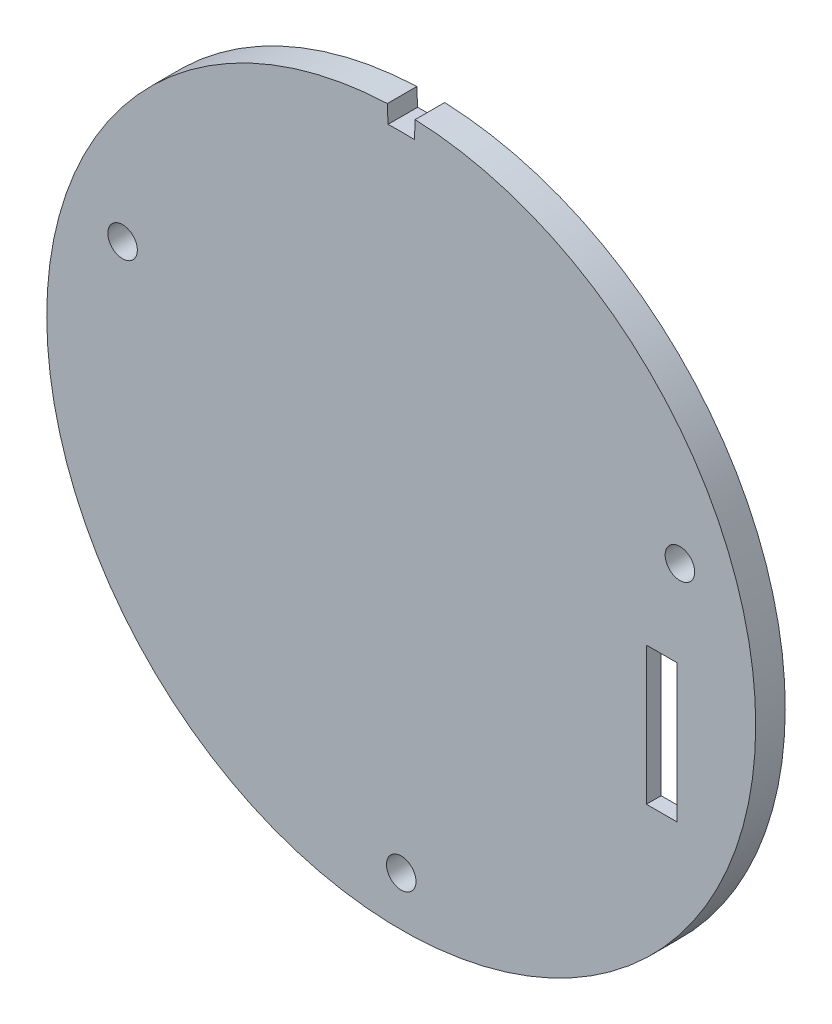
ISO-10303-21;
HEADER;
FILE_DESCRIPTION(('STEP AP214'),'2;1');
FILE_NAME('part.step','',(''),(''),'','','');
FILE_SCHEMA(('AUTOMOTIVE_DESIGN { 1 0 10303 214 1 1 1 1 }'));
ENDSEC;
DATA;
#1=APPLICATION_CONTEXT('core data for automotive mechanical design processes');
#2=APPLICATION_PROTOCOL_DEFINITION('international standard','automotive_design',2000,#1);
#3=PRODUCT_CONTEXT('',#1,'mechanical');
#4=PRODUCT('Part','Part','',(#3));
#5=PRODUCT_RELATED_PRODUCT_CATEGORY('part','',(#4));
#6=PRODUCT_DEFINITION_FORMATION('','',#4);
#7=PRODUCT_DEFINITION_CONTEXT('part definition',#1,'design');
#8=PRODUCT_DEFINITION('design','',#6,#7);
#9=PRODUCT_DEFINITION_SHAPE('','',#8);
#10=(LENGTH_UNIT() NAMED_UNIT(*) SI_UNIT(.MILLI.,.METRE.));
#11=(NAMED_UNIT(*) PLANE_ANGLE_UNIT() SI_UNIT($,.RADIAN.));
#12=(NAMED_UNIT(*) SI_UNIT($,.STERADIAN.) SOLID_ANGLE_UNIT());
#13=UNCERTAINTY_MEASURE_WITH_UNIT(LENGTH_MEASURE(1.E-05),#10,'distance_accuracy_value','');
#14=(GEOMETRIC_REPRESENTATION_CONTEXT(3) GLOBAL_UNCERTAINTY_ASSIGNED_CONTEXT((#13)) GLOBAL_UNIT_ASSIGNED_CONTEXT((#10,
#11,#12)) REPRESENTATION_CONTEXT('',''));
#15=CARTESIAN_POINT('',(0.,0.,0.));
#16=DIRECTION('',(0.,0.,1.));
#17=DIRECTION('',(1.,0.,0.));
#18=AXIS2_PLACEMENT_3D('',#15,#16,#17);
#19=CARTESIAN_POINT('',(-22.4999999999999,-22.5,-3.));
#20=DIRECTION('',(0.707106781186546,0.707106781186549,0.));
#21=DIRECTION('',(-0.707106781186549,0.707106781186546,0.));
#22=AXIS2_PLACEMENT_3D('',#19,#20,#21);
#23=PLANE('',#22);
#24=DIRECTION('',(0.,0.,1.));
#25=VECTOR('',#24,1.);
#26=CARTESIAN_POINT('',(-28.,-17.,-3.));
#27=LINE('',#26,#25);
#28=CARTESIAN_POINT('',(-28.,-17.,-3.));
#29=VERTEX_POINT('',#28);
#30=CARTESIAN_POINT('',(-28.,-17.,-1.5));
#31=VERTEX_POINT('',#30);
#32=EDGE_CURVE('E176',#29,#31,#27,.T.);
#33=ORIENTED_EDGE('',*,*,#32,.T.);
#34=DIRECTION('',(-0.707106781186549,0.707106781186546,0.));
#35=VECTOR('',#34,1.);
#36=CARTESIAN_POINT('',(-22.4999999999999,-22.5,-1.5));
#37=LINE('',#36,#35);
#38=CARTESIAN_POINT('',(-21.5,-23.5,-1.5));
#39=VERTEX_POINT('',#38);
#40=EDGE_CURVE('E221',#39,#31,#37,.T.);
#41=ORIENTED_EDGE('',*,*,#40,.F.);
#42=DIRECTION('',(0.,0.,1.));
#43=VECTOR('',#42,1.);
#44=CARTESIAN_POINT('',(-21.5,-23.5,-3.));
#45=LINE('',#44,#43);
#46=CARTESIAN_POINT('',(-21.5,-23.5,-3.));
#47=VERTEX_POINT('',#46);
#48=EDGE_CURVE('E11',#47,#39,#45,.T.);
#49=ORIENTED_EDGE('',*,*,#48,.F.);
#50=DIRECTION('',(-0.707106781186549,0.707106781186546,0.));
#51=VECTOR('',#50,1.);
#52=CARTESIAN_POINT('',(-22.4999999999999,-22.5,-3.));
#53=LINE('',#52,#51);
#54=EDGE_CURVE('E201',#47,#29,#53,.T.);
#55=ORIENTED_EDGE('',*,*,#54,.T.);
#56=EDGE_LOOP('',(#33,#41,#49,#55));
#57=FACE_BOUND('',#56,.T.);
#58=ADVANCED_FACE('F34',(#57),#23,.T.);
#59=CARTESIAN_POINT('',(0.,-23.5,-3.));
#60=DIRECTION('',(0.,1.,0.));
#61=DIRECTION('',(-1.,0.,0.));
#62=AXIS2_PLACEMENT_3D('',#59,#60,#61);
#63=PLANE('',#62);
#64=ORIENTED_EDGE('',*,*,#48,.T.);
#65=DIRECTION('',(-1.,0.,0.));
#66=VECTOR('',#65,1.);
#67=CARTESIAN_POINT('',(0.,-23.5,-1.5));
#68=LINE('',#67,#66);
#69=CARTESIAN_POINT('',(21.5,-23.5,-1.5));
#70=VERTEX_POINT('',#69);
#71=EDGE_CURVE('E421',#70,#39,#68,.T.);
#72=ORIENTED_EDGE('',*,*,#71,.F.);
#73=DIRECTION('',(0.,0.,1.));
#74=VECTOR('',#73,1.);
#75=CARTESIAN_POINT('',(21.5,-23.5,-3.));
#76=LINE('',#75,#74);
#77=CARTESIAN_POINT('',(21.5,-23.5,-3.));
#78=VERTEX_POINT('',#77);
#79=EDGE_CURVE('E43',#78,#70,#76,.T.);
#80=ORIENTED_EDGE('',*,*,#79,.F.);
#81=DIRECTION('',(-1.,0.,0.));
#82=VECTOR('',#81,1.);
#83=CARTESIAN_POINT('',(0.,-23.5,-3.));
#84=LINE('',#83,#82);
#85=EDGE_CURVE('E138',#78,#47,#84,.T.);
#86=ORIENTED_EDGE('',*,*,#85,.T.);
#87=EDGE_LOOP('',(#64,#72,#80,#86));
#88=FACE_BOUND('',#87,.T.);
#89=ADVANCED_FACE('F287',(#88),#63,.T.);
#90=CARTESIAN_POINT('',(22.5,-22.5,-3.));
#91=DIRECTION('',(-0.707106781186546,0.707106781186548,0.));
#92=DIRECTION('',(-0.707106781186549,-0.707106781186546,0.));
#93=AXIS2_PLACEMENT_3D('',#90,#91,#92);
#94=PLANE('',#93);
#95=ORIENTED_EDGE('',*,*,#79,.T.);
#96=DIRECTION('',(-0.707106781186549,-0.707106781186546,0.));
#97=VECTOR('',#96,1.);
#98=CARTESIAN_POINT('',(22.5,-22.5,-1.5));
#99=LINE('',#98,#97);
#100=CARTESIAN_POINT('',(28.,-17.,-1.5));
#101=VERTEX_POINT('',#100);
#102=EDGE_CURVE('E125',#101,#70,#99,.T.);
#103=ORIENTED_EDGE('',*,*,#102,.F.);
#104=DIRECTION('',(0.,0.,1.));
#105=VECTOR('',#104,1.);
#106=CARTESIAN_POINT('',(28.,-17.,-3.));
#107=LINE('',#106,#105);
#108=CARTESIAN_POINT('',(28.,-17.,-3.));
#109=VERTEX_POINT('',#108);
#110=EDGE_CURVE('E117',#109,#101,#107,.T.);
#111=ORIENTED_EDGE('',*,*,#110,.F.);
#112=DIRECTION('',(-0.707106781186549,-0.707106781186546,0.));
#113=VECTOR('',#112,1.);
#114=CARTESIAN_POINT('',(22.5,-22.5,-3.));
#115=LINE('',#114,#113);
#116=EDGE_CURVE('E121',#109,#78,#115,.T.);
#117=ORIENTED_EDGE('',*,*,#116,.T.);
#118=EDGE_LOOP('',(#95,#103,#111,#117));
#119=FACE_BOUND('',#118,.T.);
#120=ADVANCED_FACE('F120',(#119),#94,.T.);
#121=CARTESIAN_POINT('',(28.,0.,-3.));
#122=DIRECTION('',(-1.,0.,0.));
#123=DIRECTION('',(0.,-1.,0.));
#124=AXIS2_PLACEMENT_3D('',#121,#122,#123);
#125=PLANE('',#124);
#126=DIRECTION('',(0.,-1.,0.));
#127=VECTOR('',#126,1.);
#128=CARTESIAN_POINT('',(28.,0.,-1.5));
#129=LINE('',#128,#127);
#130=CARTESIAN_POINT('',(28.,-12.5,-1.5));
#131=VERTEX_POINT('',#130);
#132=EDGE_CURVE('E276',#131,#101,#129,.T.);
#133=ORIENTED_EDGE('',*,*,#132,.F.);
#134=DIRECTION('',(0.,0.,1.));
#135=VECTOR('',#134,1.);
#136=CARTESIAN_POINT('',(28.,-12.5,-1.5));
#137=LINE('',#136,#135);
#138=CARTESIAN_POINT('',(28.,-12.5,0.));
#139=VERTEX_POINT('',#138);
#140=EDGE_CURVE('E154',#131,#139,#137,.T.);
#141=ORIENTED_EDGE('',*,*,#140,.T.);
#142=DIRECTION('',(0.,-1.,0.));
#143=VECTOR('',#142,1.);
#144=CARTESIAN_POINT('',(28.,0.,0.));
#145=LINE('',#144,#143);
#146=CARTESIAN_POINT('',(28.,1.5,0.));
#147=VERTEX_POINT('',#146);
#148=EDGE_CURVE('E168',#147,#139,#145,.T.);
#149=ORIENTED_EDGE('',*,*,#148,.F.);
#150=DIRECTION('',(0.,0.,1.));
#151=VECTOR('',#150,1.);
#152=CARTESIAN_POINT('',(28.,1.5,-1.5));
#153=LINE('',#152,#151);
#154=CARTESIAN_POINT('',(28.,1.5,-1.5));
#155=VERTEX_POINT('',#154);
#156=EDGE_CURVE('E273',#155,#147,#153,.T.);
#157=ORIENTED_EDGE('',*,*,#156,.F.);
#158=CARTESIAN_POINT('',(28.,4.5,-1.5));
#159=VERTEX_POINT('',#158);
#160=EDGE_CURVE('E266',#159,#155,#129,.T.);
#161=ORIENTED_EDGE('',*,*,#160,.F.);
#162=DIRECTION('',(0.,0.,1.));
#163=VECTOR('',#162,1.);
#164=CARTESIAN_POINT('',(28.,4.5,-3.));
#165=LINE('',#164,#163);
#166=CARTESIAN_POINT('',(28.,4.5,-3.));
#167=VERTEX_POINT('',#166);
#168=EDGE_CURVE('E129',#167,#159,#165,.T.);
#169=ORIENTED_EDGE('',*,*,#168,.F.);
#170=DIRECTION('',(0.,-1.,0.));
#171=VECTOR('',#170,1.);
#172=CARTESIAN_POINT('',(28.,0.,-3.));
#173=LINE('',#172,#171);
#174=EDGE_CURVE('E135',#167,#109,#173,.T.);
#175=ORIENTED_EDGE('',*,*,#174,.T.);
#176=ORIENTED_EDGE('',*,*,#110,.T.);
#177=EDGE_LOOP('',(#133,#141,#149,#157,#161,#169,#175,#176));
#178=FACE_BOUND('',#177,.T.);
#179=ADVANCED_FACE('F140',(#178),#125,.T.);
#180=CARTESIAN_POINT('',(0.,4.5,-3.));
#181=DIRECTION('',(0.,-1.,0.));
#182=DIRECTION('',(1.,0.,0.));
#183=AXIS2_PLACEMENT_3D('',#180,#181,#182);
#184=PLANE('',#183);
#185=ORIENTED_EDGE('',*,*,#168,.T.);
#186=DIRECTION('',(1.,0.,0.));
#187=VECTOR('',#186,1.);
#188=CARTESIAN_POINT('',(0.,4.5,-1.5));
#189=LINE('',#188,#187);
#190=CARTESIAN_POINT('',(-28.,4.5,-1.5));
#191=VERTEX_POINT('',#190);
#192=EDGE_CURVE('E264',#191,#159,#189,.T.);
#193=ORIENTED_EDGE('',*,*,#192,.F.);
#194=DIRECTION('',(0.,0.,1.));
#195=VECTOR('',#194,1.);
#196=CARTESIAN_POINT('',(-28.,4.5,-3.));
#197=LINE('',#196,#195);
#198=CARTESIAN_POINT('',(-28.,4.5,-3.));
#199=VERTEX_POINT('',#198);
#200=EDGE_CURVE('E173',#199,#191,#197,.T.);
#201=ORIENTED_EDGE('',*,*,#200,.F.);
#202=DIRECTION('',(1.,0.,0.));
#203=VECTOR('',#202,1.);
#204=CARTESIAN_POINT('',(0.,4.5,-3.));
#205=LINE('',#204,#203);
#206=EDGE_CURVE('E143',#199,#167,#205,.T.);
#207=ORIENTED_EDGE('',*,*,#206,.T.);
#208=EDGE_LOOP('',(#185,#193,#201,#207));
#209=FACE_BOUND('',#208,.T.);
#210=ADVANCED_FACE('F277',(#209),#184,.T.);
#211=CARTESIAN_POINT('',(-28.,0.,-3.));
#212=DIRECTION('',(1.,0.,0.));
#213=DIRECTION('',(0.,0.,-1.));
#214=AXIS2_PLACEMENT_3D('',#211,#212,#213);
#215=PLANE('',#214);
#216=ORIENTED_EDGE('',*,*,#200,.T.);
#217=DIRECTION('',(0.,1.,0.));
#218=VECTOR('',#217,1.);
#219=CARTESIAN_POINT('',(-28.,0.,-1.5));
#220=LINE('',#219,#218);
#221=EDGE_CURVE('E268',#31,#191,#220,.T.);
#222=ORIENTED_EDGE('',*,*,#221,.F.);
#223=ORIENTED_EDGE('',*,*,#32,.F.);
#224=DIRECTION('',(0.,1.,0.));
#225=VECTOR('',#224,1.);
#226=CARTESIAN_POINT('',(-28.,0.,-3.));
#227=LINE('',#226,#225);
#228=EDGE_CURVE('E145',#29,#199,#227,.T.);
#229=ORIENTED_EDGE('',*,*,#228,.T.);
#230=EDGE_LOOP('',(#216,#222,#223,#229));
#231=FACE_BOUND('',#230,.T.);
#232=ADVANCED_FACE('F215',(#231),#215,.T.);
#233=CARTESIAN_POINT('',(0.,0.,-3.));
#234=DIRECTION('',(0.,0.,1.));
#235=DIRECTION('',(1.,0.,0.));
#236=AXIS2_PLACEMENT_3D('',#233,#234,#235);
#237=CYLINDRICAL_SURFACE('',#236,34.2);
#238=CARTESIAN_POINT('',(0.,0.,0.));
#239=DIRECTION('',(0.,0.,1.));
#240=DIRECTION('',(1.,0.,0.));
#241=AXIS2_PLACEMENT_3D('',#238,#239,#240);
#242=CIRCLE('',#241,34.2);
#243=CARTESIAN_POINT('',(-1.34268569896003,34.1736330394327,0.));
#244=VERTEX_POINT('',#243);
#245=CARTESIAN_POINT('',(1.34268569896004,34.1736330394327,0.));
#246=VERTEX_POINT('',#245);
#247=EDGE_CURVE('E160',#244,#246,#242,.F.);
#248=ORIENTED_EDGE('',*,*,#247,.T.);
#249=DIRECTION('',(0.,0.,1.));
#250=VECTOR('',#249,1.);
#251=CARTESIAN_POINT('',(1.34268569896004,34.1736330394327,-3.));
#252=LINE('',#251,#250);
#253=CARTESIAN_POINT('',(1.34268569896004,34.1736330394327,-3.));
#254=VERTEX_POINT('',#253);
#255=EDGE_CURVE('E179',#254,#246,#252,.T.);
#256=ORIENTED_EDGE('',*,*,#255,.F.);
#257=CARTESIAN_POINT('',(0.,0.,-3.));
#258=DIRECTION('',(0.,0.,1.));
#259=DIRECTION('',(1.,0.,0.));
#260=AXIS2_PLACEMENT_3D('',#257,#258,#259);
#261=CIRCLE('',#260,34.2);
#262=CARTESIAN_POINT('',(-1.34268569896003,34.1736330394327,-3.));
#263=VERTEX_POINT('',#262);
#264=EDGE_CURVE('E190',#263,#254,#261,.F.);
#265=ORIENTED_EDGE('',*,*,#264,.F.);
#266=DIRECTION('',(0.,0.,1.));
#267=VECTOR('',#266,1.);
#268=CARTESIAN_POINT('',(-1.34268569896003,34.1736330394327,-3.));
#269=LINE('',#268,#267);
#270=EDGE_CURVE('E38',#263,#244,#269,.T.);
#271=ORIENTED_EDGE('',*,*,#270,.T.);
#272=EDGE_LOOP('',(#248,#256,#265,#271));
#273=FACE_BOUND('',#272,.T.);
#274=ADVANCED_FACE('F188',(#273),#237,.T.);
#275=CARTESIAN_POINT('',(-2.32490406242338E-13,0.,-3.));
#276=DIRECTION('',(0.999229036240723,-0.0392598157590722,0.));
#277=DIRECTION('',(0.0392598157590722,0.999229036240723,0.));
#278=AXIS2_PLACEMENT_3D('',#275,#276,#277);
#279=PLANE('',#278);
#280=DIRECTION('',(0.0392598157590722,0.999229036240723,0.));
#281=VECTOR('',#280,1.);
#282=CARTESIAN_POINT('',(-2.32490406242338E-13,0.,0.));
#283=LINE('',#282,#281);
#284=CARTESIAN_POINT('',(1.41335336732637,35.972245304666,0.));
#285=VERTEX_POINT('',#284);
#286=EDGE_CURVE('E81',#246,#285,#283,.T.);
#287=ORIENTED_EDGE('',*,*,#286,.T.);
#288=DIRECTION('',(0.,0.,1.));
#289=VECTOR('',#288,1.);
#290=CARTESIAN_POINT('',(1.41335336732637,35.972245304666,-3.));
#291=LINE('',#290,#289);
#292=CARTESIAN_POINT('',(1.41335336732637,35.972245304666,-3.));
#293=VERTEX_POINT('',#292);
#294=EDGE_CURVE('E181',#293,#285,#291,.T.);
#295=ORIENTED_EDGE('',*,*,#294,.F.);
#296=DIRECTION('',(0.0392598157590722,0.999229036240723,0.));
#297=VECTOR('',#296,1.);
#298=CARTESIAN_POINT('',(-2.32490406242338E-13,0.,-3.));
#299=LINE('',#298,#297);
#300=EDGE_CURVE('E200',#254,#293,#299,.T.);
#301=ORIENTED_EDGE('',*,*,#300,.F.);
#302=ORIENTED_EDGE('',*,*,#255,.T.);
#303=EDGE_LOOP('',(#287,#295,#301,#302));
#304=FACE_BOUND('',#303,.T.);
#305=ADVANCED_FACE('F199',(#304),#279,.F.);
#306=CARTESIAN_POINT('',(0.,0.,-3.));
#307=DIRECTION('',(0.,0.,1.));
#308=DIRECTION('',(1.,0.,0.));
#309=AXIS2_PLACEMENT_3D('',#306,#307,#308);
#310=CYLINDRICAL_SURFACE('',#309,36.);
#311=CARTESIAN_POINT('',(0.,0.,0.));
#312=DIRECTION('',(0.,0.,1.));
#313=DIRECTION('',(1.,0.,0.));
#314=AXIS2_PLACEMENT_3D('',#311,#312,#313);
#315=CIRCLE('',#314,36.);
#316=CARTESIAN_POINT('',(-1.41335336732635,35.972245304666,0.));
#317=VERTEX_POINT('',#316);
#318=EDGE_CURVE('E165',#317,#285,#315,.T.);
#319=ORIENTED_EDGE('',*,*,#318,.F.);
#320=DIRECTION('',(0.,0.,1.));
#321=VECTOR('',#320,1.);
#322=CARTESIAN_POINT('',(-1.41335336732635,35.972245304666,-3.));
#323=LINE('',#322,#321);
#324=CARTESIAN_POINT('',(-1.41335336732635,35.972245304666,-3.));
#325=VERTEX_POINT('',#324);
#326=EDGE_CURVE('E182',#325,#317,#323,.T.);
#327=ORIENTED_EDGE('',*,*,#326,.F.);
#328=CARTESIAN_POINT('',(0.,0.,-3.));
#329=DIRECTION('',(0.,0.,1.));
#330=DIRECTION('',(1.,0.,0.));
#331=AXIS2_PLACEMENT_3D('',#328,#329,#330);
#332=CIRCLE('',#331,36.);
#333=EDGE_CURVE('E197',#325,#293,#332,.T.);
#334=ORIENTED_EDGE('',*,*,#333,.T.);
#335=ORIENTED_EDGE('',*,*,#294,.T.);
#336=EDGE_LOOP('',(#319,#327,#334,#335));
#337=FACE_BOUND('',#336,.T.);
#338=ADVANCED_FACE('F194',(#337),#310,.T.);
#339=CARTESIAN_POINT('',(0.,0.,-3.));
#340=DIRECTION('',(-0.999229036240723,-0.0392598157590651,0.));
#341=DIRECTION('',(0.0392598157590651,-0.999229036240723,0.));
#342=AXIS2_PLACEMENT_3D('',#339,#340,#341);
#343=PLANE('',#342);
#344=DIRECTION('',(0.0392598157590651,-0.999229036240723,0.));
#345=VECTOR('',#344,1.);
#346=CARTESIAN_POINT('',(0.,0.,0.));
#347=LINE('',#346,#345);
#348=EDGE_CURVE('E163',#317,#244,#347,.T.);
#349=ORIENTED_EDGE('',*,*,#348,.T.);
#350=ORIENTED_EDGE('',*,*,#270,.F.);
#351=DIRECTION('',(0.0392598157590651,-0.999229036240723,0.));
#352=VECTOR('',#351,1.);
#353=CARTESIAN_POINT('',(0.,0.,-3.));
#354=LINE('',#353,#352);
#355=EDGE_CURVE('E90',#325,#263,#354,.T.);
#356=ORIENTED_EDGE('',*,*,#355,.F.);
#357=ORIENTED_EDGE('',*,*,#326,.T.);
#358=EDGE_LOOP('',(#349,#350,#356,#357));
#359=FACE_BOUND('',#358,.T.);
#360=ADVANCED_FACE('F299',(#359),#343,.F.);
#361=CARTESIAN_POINT('',(28.3,10.3760691518005,-3.));
#362=DIRECTION('',(0.,0.,1.));
#363=DIRECTION('',(1.,0.,0.));
#364=AXIS2_PLACEMENT_3D('',#361,#362,#363);
#365=CYLINDRICAL_SURFACE('',#364,1.5);
#366=CARTESIAN_POINT('',(28.3,10.3760691518005,-3.));
#367=DIRECTION('',(0.,0.,1.));
#368=DIRECTION('',(1.,0.,0.));
#369=AXIS2_PLACEMENT_3D('',#366,#367,#368);
#370=CIRCLE('',#369,1.5);
#371=CARTESIAN_POINT('',(29.8,10.3760691518005,-3.));
#372=VERTEX_POINT('',#371);
#373=EDGE_CURVE('E203',#372,#372,#370,.T.);
#374=ORIENTED_EDGE('',*,*,#373,.F.);
#375=EDGE_LOOP('',(#374));
#376=FACE_BOUND('',#375,.T.);
#377=CARTESIAN_POINT('',(28.3,10.3760691518005,0.));
#378=DIRECTION('',(0.,0.,1.));
#379=DIRECTION('',(1.,0.,0.));
#380=AXIS2_PLACEMENT_3D('',#377,#378,#379);
#381=CIRCLE('',#380,1.5);
#382=CARTESIAN_POINT('',(29.8,10.3760691518005,0.));
#383=VERTEX_POINT('',#382);
#384=EDGE_CURVE('E157',#383,#383,#381,.T.);
#385=ORIENTED_EDGE('',*,*,#384,.T.);
#386=EDGE_LOOP('',(#385));
#387=FACE_BOUND('',#386,.T.);
#388=ADVANCED_FACE('F302',(#376,#387),#365,.F.);
#389=CARTESIAN_POINT('',(-28.3,10.3760691518005,-3.));
#390=DIRECTION('',(0.,0.,1.));
#391=DIRECTION('',(1.,0.,0.));
#392=AXIS2_PLACEMENT_3D('',#389,#390,#391);
#393=CYLINDRICAL_SURFACE('',#392,1.5);
#394=CARTESIAN_POINT('',(-28.3,10.3760691518005,-3.));
#395=DIRECTION('',(0.,0.,1.));
#396=DIRECTION('',(1.,0.,0.));
#397=AXIS2_PLACEMENT_3D('',#394,#395,#396);
#398=CIRCLE('',#397,1.5);
#399=CARTESIAN_POINT('',(-26.8,10.3760691518005,-3.));
#400=VERTEX_POINT('',#399);
#401=EDGE_CURVE('E207',#400,#400,#398,.T.);
#402=ORIENTED_EDGE('',*,*,#401,.F.);
#403=EDGE_LOOP('',(#402));
#404=FACE_BOUND('',#403,.T.);
#405=CARTESIAN_POINT('',(-28.3,10.3760691518005,0.));
#406=DIRECTION('',(0.,0.,1.));
#407=DIRECTION('',(1.,0.,0.));
#408=AXIS2_PLACEMENT_3D('',#405,#406,#407);
#409=CIRCLE('',#408,1.5);
#410=CARTESIAN_POINT('',(-26.8,10.3760691518005,0.));
#411=VERTEX_POINT('',#410);
#412=EDGE_CURVE('E153',#411,#411,#409,.T.);
#413=ORIENTED_EDGE('',*,*,#412,.T.);
#414=EDGE_LOOP('',(#413));
#415=FACE_BOUND('',#414,.T.);
#416=ADVANCED_FACE('F306',(#404,#415),#393,.F.);
#417=CARTESIAN_POINT('',(0.,-31.,-3.));
#418=DIRECTION('',(0.,0.,1.));
#419=DIRECTION('',(1.,0.,0.));
#420=AXIS2_PLACEMENT_3D('',#417,#418,#419);
#421=CYLINDRICAL_SURFACE('',#420,1.5);
#422=CARTESIAN_POINT('',(0.,-31.,-3.));
#423=DIRECTION('',(0.,0.,1.));
#424=DIRECTION('',(1.,0.,0.));
#425=AXIS2_PLACEMENT_3D('',#422,#423,#424);
#426=CIRCLE('',#425,1.5);
#427=CARTESIAN_POINT('',(1.50000000000001,-31.,-3.));
#428=VERTEX_POINT('',#427);
#429=EDGE_CURVE('E169',#428,#428,#426,.T.);
#430=ORIENTED_EDGE('',*,*,#429,.F.);
#431=EDGE_LOOP('',(#430));
#432=FACE_BOUND('',#431,.T.);
#433=CARTESIAN_POINT('',(0.,-31.,0.));
#434=DIRECTION('',(0.,0.,1.));
#435=DIRECTION('',(1.,0.,0.));
#436=AXIS2_PLACEMENT_3D('',#433,#434,#435);
#437=CIRCLE('',#436,1.5);
#438=CARTESIAN_POINT('',(1.50000000000001,-31.,0.));
#439=VERTEX_POINT('',#438);
#440=EDGE_CURVE('E150',#439,#439,#437,.T.);
#441=ORIENTED_EDGE('',*,*,#440,.T.);
#442=EDGE_LOOP('',(#441));
#443=FACE_BOUND('',#442,.T.);
#444=ADVANCED_FACE('F36',(#432,#443),#421,.F.);
#445=CARTESIAN_POINT('',(0.,0.,-3.));
#446=DIRECTION('',(0.,0.,1.));
#447=DIRECTION('',(1.,0.,0.));
#448=AXIS2_PLACEMENT_3D('',#445,#446,#447);
#449=PLANE('',#448);
#450=ORIENTED_EDGE('',*,*,#429,.T.);
#451=EDGE_LOOP('',(#450));
#452=FACE_BOUND('',#451,.T.);
#453=ORIENTED_EDGE('',*,*,#401,.T.);
#454=EDGE_LOOP('',(#453));
#455=FACE_BOUND('',#454,.T.);
#456=ORIENTED_EDGE('',*,*,#373,.T.);
#457=EDGE_LOOP('',(#456));
#458=FACE_BOUND('',#457,.T.);
#459=ORIENTED_EDGE('',*,*,#264,.T.);
#460=ORIENTED_EDGE('',*,*,#300,.T.);
#461=ORIENTED_EDGE('',*,*,#333,.F.);
#462=ORIENTED_EDGE('',*,*,#355,.T.);
#463=EDGE_LOOP('',(#459,#460,#461,#462));
#464=FACE_BOUND('',#463,.T.);
#465=ORIENTED_EDGE('',*,*,#54,.F.);
#466=ORIENTED_EDGE('',*,*,#85,.F.);
#467=ORIENTED_EDGE('',*,*,#116,.F.);
#468=ORIENTED_EDGE('',*,*,#174,.F.);
#469=ORIENTED_EDGE('',*,*,#206,.F.);
#470=ORIENTED_EDGE('',*,*,#228,.F.);
#471=EDGE_LOOP('',(#465,#466,#467,#468,#469,#470));
#472=FACE_BOUND('',#471,.T.);
#473=ADVANCED_FACE('F133',(#452,#455,#458,#464,#472),#449,.F.);
#474=CARTESIAN_POINT('',(0.,0.,0.));
#475=DIRECTION('',(0.,0.,1.));
#476=DIRECTION('',(1.,0.,0.));
#477=AXIS2_PLACEMENT_3D('',#474,#475,#476);
#478=PLANE('',#477);
#479=ORIENTED_EDGE('',*,*,#440,.F.);
#480=EDGE_LOOP('',(#479));
#481=FACE_BOUND('',#480,.T.);
#482=ORIENTED_EDGE('',*,*,#412,.F.);
#483=EDGE_LOOP('',(#482));
#484=FACE_BOUND('',#483,.T.);
#485=ORIENTED_EDGE('',*,*,#384,.F.);
#486=EDGE_LOOP('',(#485));
#487=FACE_BOUND('',#486,.T.);
#488=ORIENTED_EDGE('',*,*,#247,.F.);
#489=ORIENTED_EDGE('',*,*,#348,.F.);
#490=ORIENTED_EDGE('',*,*,#318,.T.);
#491=ORIENTED_EDGE('',*,*,#286,.F.);
#492=EDGE_LOOP('',(#488,#489,#490,#491));
#493=FACE_BOUND('',#492,.T.);
#494=ORIENTED_EDGE('',*,*,#148,.T.);
#495=DIRECTION('',(1.,0.,0.));
#496=VECTOR('',#495,1.);
#497=CARTESIAN_POINT('',(0.,-12.5,0.));
#498=LINE('',#497,#496);
#499=CARTESIAN_POINT('',(24.9,-12.5,0.));
#500=VERTEX_POINT('',#499);
#501=EDGE_CURVE('E249',#500,#139,#498,.T.);
#502=ORIENTED_EDGE('',*,*,#501,.F.);
#503=DIRECTION('',(0.,-1.,0.));
#504=VECTOR('',#503,1.);
#505=CARTESIAN_POINT('',(24.9,0.,0.));
#506=LINE('',#505,#504);
#507=CARTESIAN_POINT('',(24.9,1.5,0.));
#508=VERTEX_POINT('',#507);
#509=EDGE_CURVE('E400',#508,#500,#506,.T.);
#510=ORIENTED_EDGE('',*,*,#509,.F.);
#511=DIRECTION('',(-1.,0.,0.));
#512=VECTOR('',#511,1.);
#513=CARTESIAN_POINT('',(0.,1.5,0.));
#514=LINE('',#513,#512);
#515=EDGE_CURVE('E51',#147,#508,#514,.T.);
#516=ORIENTED_EDGE('',*,*,#515,.F.);
#517=EDGE_LOOP('',(#494,#502,#510,#516));
#518=FACE_BOUND('',#517,.T.);
#519=ADVANCED_FACE('F191',(#481,#484,#487,#493,#518),#478,.T.);
#520=CARTESIAN_POINT('',(0.,-12.5,-1.5));
#521=DIRECTION('',(0.,-1.,0.));
#522=DIRECTION('',(0.,0.,-1.));
#523=AXIS2_PLACEMENT_3D('',#520,#521,#522);
#524=PLANE('',#523);
#525=ORIENTED_EDGE('',*,*,#501,.T.);
#526=ORIENTED_EDGE('',*,*,#140,.F.);
#527=DIRECTION('',(1.,0.,0.));
#528=VECTOR('',#527,1.);
#529=CARTESIAN_POINT('',(0.,-12.5,-1.5));
#530=LINE('',#529,#528);
#531=CARTESIAN_POINT('',(24.9,-12.5,-1.5));
#532=VERTEX_POINT('',#531);
#533=EDGE_CURVE('E405',#532,#131,#530,.T.);
#534=ORIENTED_EDGE('',*,*,#533,.F.);
#535=DIRECTION('',(0.,0.,1.));
#536=VECTOR('',#535,1.);
#537=CARTESIAN_POINT('',(24.9,-12.5,-1.5));
#538=LINE('',#537,#536);
#539=EDGE_CURVE('E401',#532,#500,#538,.T.);
#540=ORIENTED_EDGE('',*,*,#539,.T.);
#541=EDGE_LOOP('',(#525,#526,#534,#540));
#542=FACE_BOUND('',#541,.T.);
#543=ADVANCED_FACE('F321',(#542),#524,.F.);
#544=CARTESIAN_POINT('',(0.,1.5,-1.5));
#545=DIRECTION('',(0.,1.,0.));
#546=DIRECTION('',(-1.,0.,0.));
#547=AXIS2_PLACEMENT_3D('',#544,#545,#546);
#548=PLANE('',#547);
#549=ORIENTED_EDGE('',*,*,#515,.T.);
#550=DIRECTION('',(0.,0.,1.));
#551=VECTOR('',#550,1.);
#552=CARTESIAN_POINT('',(24.9,1.5,-1.5));
#553=LINE('',#552,#551);
#554=CARTESIAN_POINT('',(24.9,1.5,-1.5));
#555=VERTEX_POINT('',#554);
#556=EDGE_CURVE('E403',#555,#508,#553,.T.);
#557=ORIENTED_EDGE('',*,*,#556,.F.);
#558=DIRECTION('',(-1.,0.,0.));
#559=VECTOR('',#558,1.);
#560=CARTESIAN_POINT('',(0.,1.5,-1.5));
#561=LINE('',#560,#559);
#562=EDGE_CURVE('E274',#155,#555,#561,.T.);
#563=ORIENTED_EDGE('',*,*,#562,.F.);
#564=ORIENTED_EDGE('',*,*,#156,.T.);
#565=EDGE_LOOP('',(#549,#557,#563,#564));
#566=FACE_BOUND('',#565,.T.);
#567=ADVANCED_FACE('F330',(#566),#548,.F.);
#568=CARTESIAN_POINT('',(24.9,0.,-1.5));
#569=DIRECTION('',(-1.,0.,0.));
#570=DIRECTION('',(0.,0.,1.));
#571=AXIS2_PLACEMENT_3D('',#568,#569,#570);
#572=PLANE('',#571);
#573=ORIENTED_EDGE('',*,*,#509,.T.);
#574=ORIENTED_EDGE('',*,*,#539,.F.);
#575=DIRECTION('',(0.,-1.,0.));
#576=VECTOR('',#575,1.);
#577=CARTESIAN_POINT('',(24.9,0.,-1.5));
#578=LINE('',#577,#576);
#579=EDGE_CURVE('E256',#555,#532,#578,.T.);
#580=ORIENTED_EDGE('',*,*,#579,.F.);
#581=ORIENTED_EDGE('',*,*,#556,.T.);
#582=EDGE_LOOP('',(#573,#574,#580,#581));
#583=FACE_BOUND('',#582,.T.);
#584=ADVANCED_FACE('F376',(#583),#572,.F.);
#585=CARTESIAN_POINT('',(0.,0.,-1.5));
#586=DIRECTION('',(0.,0.,1.));
#587=DIRECTION('',(1.,0.,0.));
#588=AXIS2_PLACEMENT_3D('',#585,#586,#587);
#589=PLANE('',#588);
#590=ORIENTED_EDGE('',*,*,#533,.T.);
#591=ORIENTED_EDGE('',*,*,#132,.T.);
#592=ORIENTED_EDGE('',*,*,#102,.T.);
#593=ORIENTED_EDGE('',*,*,#71,.T.);
#594=ORIENTED_EDGE('',*,*,#40,.T.);
#595=ORIENTED_EDGE('',*,*,#221,.T.);
#596=ORIENTED_EDGE('',*,*,#192,.T.);
#597=ORIENTED_EDGE('',*,*,#160,.T.);
#598=ORIENTED_EDGE('',*,*,#562,.T.);
#599=ORIENTED_EDGE('',*,*,#579,.T.);
#600=EDGE_LOOP('',(#590,#591,#592,#593,#594,#595,#596,#597,#598,#599));
#601=FACE_BOUND('',#600,.T.);
#602=ADVANCED_FACE('F265',(#601),#589,.F.);
#603=CLOSED_SHELL('',(#58,#89,#120,#179,#210,#232,#274,#305,#338,#360,#388,#416,#444,#473,#519,
#543,#567,#584,#602));
#604=MANIFOLD_SOLID_BREP('B2',#603);
#605=ADVANCED_BREP_SHAPE_REPRESENTATION('',(#18,#604),#14);
#606=SHAPE_DEFINITION_REPRESENTATION(#9,#605);
ENDSEC;
END-ISO-10303-21;
